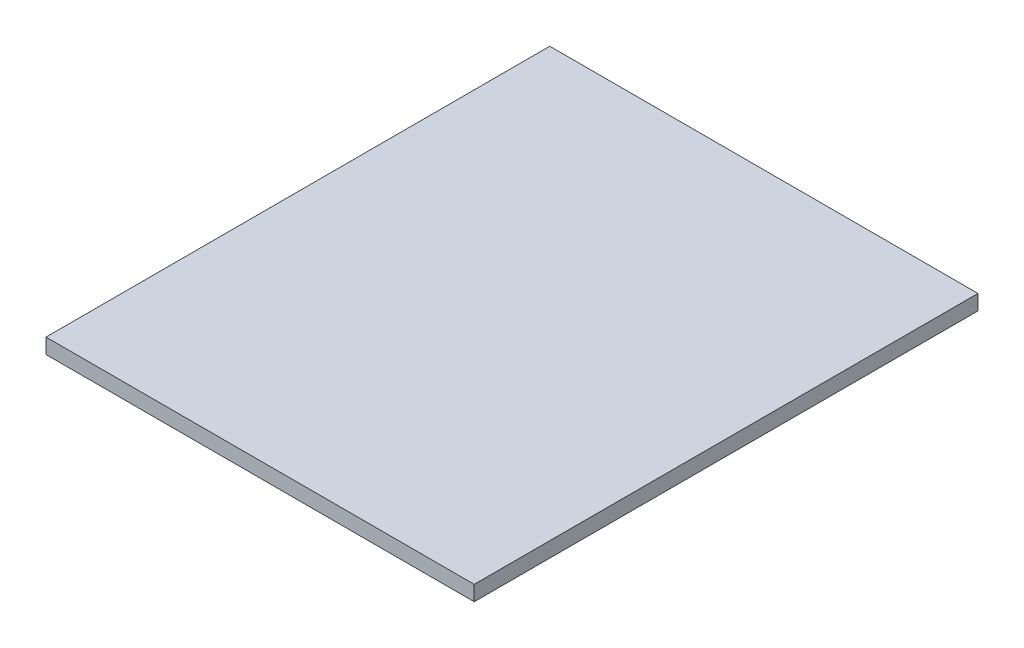
ISO-10303-21;
HEADER;
FILE_DESCRIPTION(('STEP AP214'),'2;1');
FILE_NAME('part.step','',(''),(''),'','','');
FILE_SCHEMA(('AUTOMOTIVE_DESIGN { 1 0 10303 214 1 1 1 1 }'));
ENDSEC;
DATA;
#1=APPLICATION_CONTEXT('core data for automotive mechanical design processes');
#2=APPLICATION_PROTOCOL_DEFINITION('international standard','automotive_design',2000,#1);
#3=PRODUCT_CONTEXT('',#1,'mechanical');
#4=PRODUCT('Part','Part','',(#3));
#5=PRODUCT_RELATED_PRODUCT_CATEGORY('part','',(#4));
#6=PRODUCT_DEFINITION_FORMATION('','',#4);
#7=PRODUCT_DEFINITION_CONTEXT('part definition',#1,'design');
#8=PRODUCT_DEFINITION('design','',#6,#7);
#9=PRODUCT_DEFINITION_SHAPE('','',#8);
#10=(LENGTH_UNIT() NAMED_UNIT(*) SI_UNIT(.MILLI.,.METRE.));
#11=(NAMED_UNIT(*) PLANE_ANGLE_UNIT() SI_UNIT($,.RADIAN.));
#12=(NAMED_UNIT(*) SI_UNIT($,.STERADIAN.) SOLID_ANGLE_UNIT());
#13=UNCERTAINTY_MEASURE_WITH_UNIT(LENGTH_MEASURE(1.E-05),#10,'distance_accuracy_value','');
#14=(GEOMETRIC_REPRESENTATION_CONTEXT(3) GLOBAL_UNCERTAINTY_ASSIGNED_CONTEXT((#13)) GLOBAL_UNIT_ASSIGNED_CONTEXT((#10,
#11,#12)) REPRESENTATION_CONTEXT('',''));
#15=CARTESIAN_POINT('',(0.,0.,0.));
#16=DIRECTION('',(0.,0.,1.));
#17=DIRECTION('',(1.,0.,0.));
#18=AXIS2_PLACEMENT_3D('',#15,#16,#17);
#19=CARTESIAN_POINT('',(0.,3.,-100.));
#20=DIRECTION('',(1.,0.,0.));
#21=DIRECTION('',(0.,0.,-1.));
#22=AXIS2_PLACEMENT_3D('',#19,#20,#21);
#23=PLANE('',#22);
#24=DIRECTION('',(0.,0.,1.));
#25=VECTOR('',#24,1.);
#26=CARTESIAN_POINT('',(0.,0.,-100.));
#27=LINE('',#26,#25);
#28=CARTESIAN_POINT('',(0.,0.,-100.));
#29=VERTEX_POINT('',#28);
#30=CARTESIAN_POINT('',(0.,0.,0.));
#31=VERTEX_POINT('',#30);
#32=EDGE_CURVE('E98',#29,#31,#27,.T.);
#33=ORIENTED_EDGE('',*,*,#32,.T.);
#34=DIRECTION('',(0.,-1.,0.));
#35=VECTOR('',#34,1.);
#36=CARTESIAN_POINT('',(0.,3.,0.));
#37=LINE('',#36,#35);
#38=CARTESIAN_POINT('',(0.,3.,0.));
#39=VERTEX_POINT('',#38);
#40=EDGE_CURVE('E11',#39,#31,#37,.T.);
#41=ORIENTED_EDGE('',*,*,#40,.F.);
#42=DIRECTION('',(0.,0.,1.));
#43=VECTOR('',#42,1.);
#44=CARTESIAN_POINT('',(0.,3.,-100.));
#45=LINE('',#44,#43);
#46=CARTESIAN_POINT('',(0.,3.,-100.));
#47=VERTEX_POINT('',#46);
#48=EDGE_CURVE('E86',#47,#39,#45,.T.);
#49=ORIENTED_EDGE('',*,*,#48,.F.);
#50=DIRECTION('',(0.,-1.,0.));
#51=VECTOR('',#50,1.);
#52=CARTESIAN_POINT('',(0.,3.,-100.));
#53=LINE('',#52,#51);
#54=EDGE_CURVE('E94',#47,#29,#53,.T.);
#55=ORIENTED_EDGE('',*,*,#54,.T.);
#56=EDGE_LOOP('',(#33,#41,#49,#55));
#57=FACE_BOUND('',#56,.T.);
#58=ADVANCED_FACE('F35',(#57),#23,.F.);
#59=CARTESIAN_POINT('',(0.,3.,0.));
#60=DIRECTION('',(0.,0.,-1.));
#61=DIRECTION('',(-1.,0.,0.));
#62=AXIS2_PLACEMENT_3D('',#59,#60,#61);
#63=PLANE('',#62);
#64=DIRECTION('',(1.,0.,0.));
#65=VECTOR('',#64,1.);
#66=CARTESIAN_POINT('',(0.,0.,0.));
#67=LINE('',#66,#65);
#68=CARTESIAN_POINT('',(85.,0.,0.));
#69=VERTEX_POINT('',#68);
#70=EDGE_CURVE('E90',#31,#69,#67,.T.);
#71=ORIENTED_EDGE('',*,*,#70,.T.);
#72=DIRECTION('',(0.,-1.,0.));
#73=VECTOR('',#72,1.);
#74=CARTESIAN_POINT('',(85.,3.,0.));
#75=LINE('',#74,#73);
#76=CARTESIAN_POINT('',(85.,3.,0.));
#77=VERTEX_POINT('',#76);
#78=EDGE_CURVE('E43',#77,#69,#75,.T.);
#79=ORIENTED_EDGE('',*,*,#78,.F.);
#80=DIRECTION('',(1.,0.,0.));
#81=VECTOR('',#80,1.);
#82=CARTESIAN_POINT('',(0.,3.,0.));
#83=LINE('',#82,#81);
#84=EDGE_CURVE('E81',#39,#77,#83,.T.);
#85=ORIENTED_EDGE('',*,*,#84,.F.);
#86=ORIENTED_EDGE('',*,*,#40,.T.);
#87=EDGE_LOOP('',(#71,#79,#85,#86));
#88=FACE_BOUND('',#87,.T.);
#89=ADVANCED_FACE('F89',(#88),#63,.F.);
#90=CARTESIAN_POINT('',(85.,3.,-100.));
#91=DIRECTION('',(-1.,0.,0.));
#92=DIRECTION('',(0.,0.,1.));
#93=AXIS2_PLACEMENT_3D('',#90,#91,#92);
#94=PLANE('',#93);
#95=DIRECTION('',(0.,0.,-1.));
#96=VECTOR('',#95,1.);
#97=CARTESIAN_POINT('',(85.,0.,-100.));
#98=LINE('',#97,#96);
#99=CARTESIAN_POINT('',(85.,0.,-100.));
#100=VERTEX_POINT('',#99);
#101=EDGE_CURVE('E68',#69,#100,#98,.T.);
#102=ORIENTED_EDGE('',*,*,#101,.T.);
#103=DIRECTION('',(0.,-1.,0.));
#104=VECTOR('',#103,1.);
#105=CARTESIAN_POINT('',(85.,3.,-100.));
#106=LINE('',#105,#104);
#107=CARTESIAN_POINT('',(85.,3.,-100.));
#108=VERTEX_POINT('',#107);
#109=EDGE_CURVE('E91',#108,#100,#106,.T.);
#110=ORIENTED_EDGE('',*,*,#109,.F.);
#111=DIRECTION('',(0.,0.,-1.));
#112=VECTOR('',#111,1.);
#113=CARTESIAN_POINT('',(85.,3.,-100.));
#114=LINE('',#113,#112);
#115=EDGE_CURVE('E84',#77,#108,#114,.T.);
#116=ORIENTED_EDGE('',*,*,#115,.F.);
#117=ORIENTED_EDGE('',*,*,#78,.T.);
#118=EDGE_LOOP('',(#102,#110,#116,#117));
#119=FACE_BOUND('',#118,.T.);
#120=ADVANCED_FACE('F92',(#119),#94,.F.);
#121=CARTESIAN_POINT('',(0.,3.,-100.));
#122=DIRECTION('',(0.,0.,1.));
#123=DIRECTION('',(1.,0.,0.));
#124=AXIS2_PLACEMENT_3D('',#121,#122,#123);
#125=PLANE('',#124);
#126=DIRECTION('',(-1.,0.,0.));
#127=VECTOR('',#126,1.);
#128=CARTESIAN_POINT('',(0.,0.,-100.));
#129=LINE('',#128,#127);
#130=EDGE_CURVE('E74',#100,#29,#129,.T.);
#131=ORIENTED_EDGE('',*,*,#130,.T.);
#132=ORIENTED_EDGE('',*,*,#54,.F.);
#133=DIRECTION('',(-1.,0.,0.));
#134=VECTOR('',#133,1.);
#135=CARTESIAN_POINT('',(0.,3.,-100.));
#136=LINE('',#135,#134);
#137=EDGE_CURVE('E51',#108,#47,#136,.T.);
#138=ORIENTED_EDGE('',*,*,#137,.F.);
#139=ORIENTED_EDGE('',*,*,#109,.T.);
#140=EDGE_LOOP('',(#131,#132,#138,#139));
#141=FACE_BOUND('',#140,.T.);
#142=ADVANCED_FACE('F105',(#141),#125,.F.);
#143=CARTESIAN_POINT('',(0.,3.,0.));
#144=DIRECTION('',(0.,1.,0.));
#145=DIRECTION('',(0.,0.,1.));
#146=AXIS2_PLACEMENT_3D('',#143,#144,#145);
#147=PLANE('',#146);
#148=ORIENTED_EDGE('',*,*,#48,.T.);
#149=ORIENTED_EDGE('',*,*,#84,.T.);
#150=ORIENTED_EDGE('',*,*,#115,.T.);
#151=ORIENTED_EDGE('',*,*,#137,.T.);
#152=EDGE_LOOP('',(#148,#149,#150,#151));
#153=FACE_BOUND('',#152,.T.);
#154=ADVANCED_FACE('F82',(#153),#147,.T.);
#155=CARTESIAN_POINT('',(0.,0.,0.));
#156=DIRECTION('',(0.,1.,0.));
#157=DIRECTION('',(0.,0.,1.));
#158=AXIS2_PLACEMENT_3D('',#155,#156,#157);
#159=PLANE('',#158);
#160=ORIENTED_EDGE('',*,*,#32,.F.);
#161=ORIENTED_EDGE('',*,*,#130,.F.);
#162=ORIENTED_EDGE('',*,*,#101,.F.);
#163=ORIENTED_EDGE('',*,*,#70,.F.);
#164=EDGE_LOOP('',(#160,#161,#162,#163));
#165=FACE_BOUND('',#164,.T.);
#166=ADVANCED_FACE('F108',(#165),#159,.F.);
#167=CLOSED_SHELL('',(#58,#89,#120,#142,#154,#166));
#168=MANIFOLD_SOLID_BREP('B2',#167);
#169=ADVANCED_BREP_SHAPE_REPRESENTATION('',(#18,#168),#14);
#170=SHAPE_DEFINITION_REPRESENTATION(#9,#169);
ENDSEC;
END-ISO-10303-21;
